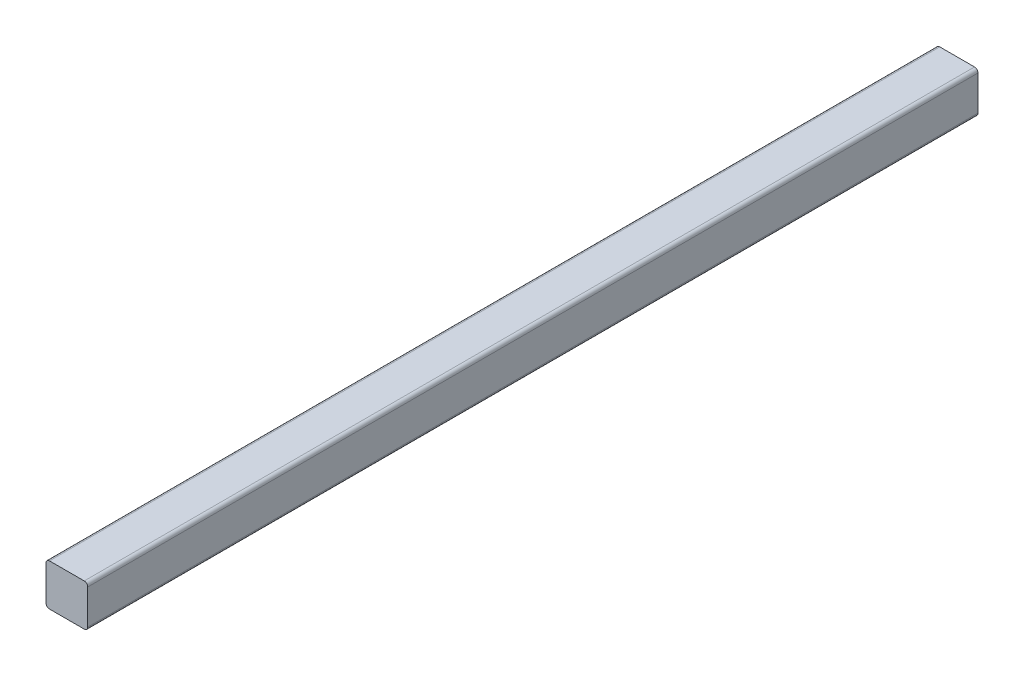
ISO-10303-21;
HEADER;
FILE_DESCRIPTION(('STEP AP214'),'2;1');
FILE_NAME('part.step','',(''),(''),'','','');
FILE_SCHEMA(('AUTOMOTIVE_DESIGN { 1 0 10303 214 1 1 1 1 }'));
ENDSEC;
DATA;
#1=APPLICATION_CONTEXT('core data for automotive mechanical design processes');
#2=APPLICATION_PROTOCOL_DEFINITION('international standard','automotive_design',2000,#1);
#3=PRODUCT_CONTEXT('',#1,'mechanical');
#4=PRODUCT('Part','Part','',(#3));
#5=PRODUCT_RELATED_PRODUCT_CATEGORY('part','',(#4));
#6=PRODUCT_DEFINITION_FORMATION('','',#4);
#7=PRODUCT_DEFINITION_CONTEXT('part definition',#1,'design');
#8=PRODUCT_DEFINITION('design','',#6,#7);
#9=PRODUCT_DEFINITION_SHAPE('','',#8);
#10=(LENGTH_UNIT() NAMED_UNIT(*) SI_UNIT(.MILLI.,.METRE.));
#11=(NAMED_UNIT(*) PLANE_ANGLE_UNIT() SI_UNIT($,.RADIAN.));
#12=(NAMED_UNIT(*) SI_UNIT($,.STERADIAN.) SOLID_ANGLE_UNIT());
#13=UNCERTAINTY_MEASURE_WITH_UNIT(LENGTH_MEASURE(1.E-05),#10,'distance_accuracy_value','');
#14=(GEOMETRIC_REPRESENTATION_CONTEXT(3) GLOBAL_UNCERTAINTY_ASSIGNED_CONTEXT((#13)) GLOBAL_UNIT_ASSIGNED_CONTEXT((#10,
#11,#12)) REPRESENTATION_CONTEXT('',''));
#15=CARTESIAN_POINT('',(0.,0.,0.));
#16=DIRECTION('',(0.,0.,1.));
#17=DIRECTION('',(1.,0.,0.));
#18=AXIS2_PLACEMENT_3D('',#15,#16,#17);
#19=CARTESIAN_POINT('',(19.05,-19.05,812.8));
#20=DIRECTION('',(-1.,0.,0.));
#21=DIRECTION('',(0.,0.,1.));
#22=AXIS2_PLACEMENT_3D('',#19,#20,#21);
#23=PLANE('',#22);
#24=DIRECTION('',(0.,1.,0.));
#25=VECTOR('',#24,1.);
#26=CARTESIAN_POINT('',(19.05,-19.05,812.8));
#27=LINE('',#26,#25);
#28=CARTESIAN_POINT('',(19.05,-15.875,812.8));
#29=VERTEX_POINT('',#28);
#30=CARTESIAN_POINT('',(19.05,15.875,812.8));
#31=VERTEX_POINT('',#30);
#32=EDGE_CURVE('E134',#29,#31,#27,.T.);
#33=ORIENTED_EDGE('',*,*,#32,.F.);
#34=DIRECTION('',(0.,0.,-1.));
#35=VECTOR('',#34,1.);
#36=CARTESIAN_POINT('',(19.05,-15.875,812.8));
#37=LINE('',#36,#35);
#38=CARTESIAN_POINT('',(19.05,-15.875,0.));
#39=VERTEX_POINT('',#38);
#40=EDGE_CURVE('E11',#29,#39,#37,.T.);
#41=ORIENTED_EDGE('',*,*,#40,.T.);
#42=DIRECTION('',(0.,1.,0.));
#43=VECTOR('',#42,1.);
#44=CARTESIAN_POINT('',(19.05,-19.05,0.));
#45=LINE('',#44,#43);
#46=CARTESIAN_POINT('',(19.05,15.875,0.));
#47=VERTEX_POINT('',#46);
#48=EDGE_CURVE('E136',#39,#47,#45,.T.);
#49=ORIENTED_EDGE('',*,*,#48,.T.);
#50=DIRECTION('',(0.,0.,-1.));
#51=VECTOR('',#50,1.);
#52=CARTESIAN_POINT('',(19.05,15.875,812.8));
#53=LINE('',#52,#51);
#54=EDGE_CURVE('E47',#47,#31,#53,.F.);
#55=ORIENTED_EDGE('',*,*,#54,.T.);
#56=EDGE_LOOP('',(#33,#41,#49,#55));
#57=FACE_BOUND('',#56,.T.);
#58=ADVANCED_FACE('F39',(#57),#23,.F.);
#59=CARTESIAN_POINT('',(-19.05,19.05,812.8));
#60=DIRECTION('',(0.,-1.,0.));
#61=DIRECTION('',(0.,0.,-1.));
#62=AXIS2_PLACEMENT_3D('',#59,#60,#61);
#63=PLANE('',#62);
#64=DIRECTION('',(-1.,0.,0.));
#65=VECTOR('',#64,1.);
#66=CARTESIAN_POINT('',(-19.05,19.05,0.));
#67=LINE('',#66,#65);
#68=CARTESIAN_POINT('',(15.875,19.05,0.));
#69=VERTEX_POINT('',#68);
#70=CARTESIAN_POINT('',(-15.875,19.05,0.));
#71=VERTEX_POINT('',#70);
#72=EDGE_CURVE('E132',#69,#71,#67,.T.);
#73=ORIENTED_EDGE('',*,*,#72,.T.);
#74=DIRECTION('',(0.,0.,-1.));
#75=VECTOR('',#74,1.);
#76=CARTESIAN_POINT('',(-15.875,19.05,812.8));
#77=LINE('',#76,#75);
#78=CARTESIAN_POINT('',(-15.875,19.05,812.8));
#79=VERTEX_POINT('',#78);
#80=EDGE_CURVE('E111',#71,#79,#77,.F.);
#81=ORIENTED_EDGE('',*,*,#80,.T.);
#82=DIRECTION('',(-1.,0.,0.));
#83=VECTOR('',#82,1.);
#84=CARTESIAN_POINT('',(-19.05,19.05,812.8));
#85=LINE('',#84,#83);
#86=CARTESIAN_POINT('',(15.875,19.05,812.8));
#87=VERTEX_POINT('',#86);
#88=EDGE_CURVE('E172',#87,#79,#85,.T.);
#89=ORIENTED_EDGE('',*,*,#88,.F.);
#90=DIRECTION('',(0.,0.,-1.));
#91=VECTOR('',#90,1.);
#92=CARTESIAN_POINT('',(15.875,19.05,812.8));
#93=LINE('',#92,#91);
#94=EDGE_CURVE('E116',#87,#69,#93,.T.);
#95=ORIENTED_EDGE('',*,*,#94,.T.);
#96=EDGE_LOOP('',(#73,#81,#89,#95));
#97=FACE_BOUND('',#96,.T.);
#98=ADVANCED_FACE('F176',(#97),#63,.F.);
#99=CARTESIAN_POINT('',(-19.05,-19.05,812.8));
#100=DIRECTION('',(1.,0.,0.));
#101=DIRECTION('',(0.,0.,-1.));
#102=AXIS2_PLACEMENT_3D('',#99,#100,#101);
#103=PLANE('',#102);
#104=DIRECTION('',(0.,-1.,0.));
#105=VECTOR('',#104,1.);
#106=CARTESIAN_POINT('',(-19.05,-19.05,812.8));
#107=LINE('',#106,#105);
#108=CARTESIAN_POINT('',(-19.05,15.875,812.8));
#109=VERTEX_POINT('',#108);
#110=CARTESIAN_POINT('',(-19.05,-15.875,812.8));
#111=VERTEX_POINT('',#110);
#112=EDGE_CURVE('E125',#109,#111,#107,.T.);
#113=ORIENTED_EDGE('',*,*,#112,.F.);
#114=DIRECTION('',(0.,0.,-1.));
#115=VECTOR('',#114,1.);
#116=CARTESIAN_POINT('',(-19.05,15.875,812.8));
#117=LINE('',#116,#115);
#118=CARTESIAN_POINT('',(-19.05,15.875,0.));
#119=VERTEX_POINT('',#118);
#120=EDGE_CURVE('E110',#109,#119,#117,.T.);
#121=ORIENTED_EDGE('',*,*,#120,.T.);
#122=DIRECTION('',(0.,-1.,0.));
#123=VECTOR('',#122,1.);
#124=CARTESIAN_POINT('',(-19.05,-19.05,0.));
#125=LINE('',#124,#123);
#126=CARTESIAN_POINT('',(-19.05,-15.875,0.));
#127=VERTEX_POINT('',#126);
#128=EDGE_CURVE('E123',#119,#127,#125,.T.);
#129=ORIENTED_EDGE('',*,*,#128,.T.);
#130=DIRECTION('',(0.,0.,-1.));
#131=VECTOR('',#130,1.);
#132=CARTESIAN_POINT('',(-19.05,-15.875,812.8));
#133=LINE('',#132,#131);
#134=EDGE_CURVE('E127',#127,#111,#133,.F.);
#135=ORIENTED_EDGE('',*,*,#134,.T.);
#136=EDGE_LOOP('',(#113,#121,#129,#135));
#137=FACE_BOUND('',#136,.T.);
#138=ADVANCED_FACE('F122',(#137),#103,.F.);
#139=CARTESIAN_POINT('',(-19.05,-19.05,812.8));
#140=DIRECTION('',(0.,1.,0.));
#141=DIRECTION('',(0.,0.,1.));
#142=AXIS2_PLACEMENT_3D('',#139,#140,#141);
#143=PLANE('',#142);
#144=DIRECTION('',(1.,0.,0.));
#145=VECTOR('',#144,1.);
#146=CARTESIAN_POINT('',(-19.05,-19.05,812.8));
#147=LINE('',#146,#145);
#148=CARTESIAN_POINT('',(-15.875,-19.05,812.8));
#149=VERTEX_POINT('',#148);
#150=CARTESIAN_POINT('',(15.875,-19.05,812.8));
#151=VERTEX_POINT('',#150);
#152=EDGE_CURVE('E140',#149,#151,#147,.T.);
#153=ORIENTED_EDGE('',*,*,#152,.F.);
#154=DIRECTION('',(0.,0.,-1.));
#155=VECTOR('',#154,1.);
#156=CARTESIAN_POINT('',(-15.875,-19.05,812.8));
#157=LINE('',#156,#155);
#158=CARTESIAN_POINT('',(-15.875,-19.05,0.));
#159=VERTEX_POINT('',#158);
#160=EDGE_CURVE('E157',#149,#159,#157,.T.);
#161=ORIENTED_EDGE('',*,*,#160,.T.);
#162=DIRECTION('',(1.,0.,0.));
#163=VECTOR('',#162,1.);
#164=CARTESIAN_POINT('',(-19.05,-19.05,0.));
#165=LINE('',#164,#163);
#166=CARTESIAN_POINT('',(15.875,-19.05,0.));
#167=VERTEX_POINT('',#166);
#168=EDGE_CURVE('E131',#159,#167,#165,.T.);
#169=ORIENTED_EDGE('',*,*,#168,.T.);
#170=DIRECTION('',(0.,0.,-1.));
#171=VECTOR('',#170,1.);
#172=CARTESIAN_POINT('',(15.875,-19.05,812.8));
#173=LINE('',#172,#171);
#174=EDGE_CURVE('E54',#167,#151,#173,.F.);
#175=ORIENTED_EDGE('',*,*,#174,.T.);
#176=EDGE_LOOP('',(#153,#161,#169,#175));
#177=FACE_BOUND('',#176,.T.);
#178=ADVANCED_FACE('F183',(#177),#143,.F.);
#179=CARTESIAN_POINT('',(0.,0.,812.8));
#180=DIRECTION('',(0.,0.,-1.));
#181=DIRECTION('',(-1.,0.,0.));
#182=AXIS2_PLACEMENT_3D('',#179,#180,#181);
#183=PLANE('',#182);
#184=ORIENTED_EDGE('',*,*,#88,.T.);
#185=CARTESIAN_POINT('',(-15.875,15.875,812.8));
#186=DIRECTION('',(0.,0.,-1.));
#187=DIRECTION('',(-1.,0.,0.));
#188=AXIS2_PLACEMENT_3D('',#185,#186,#187);
#189=CIRCLE('',#188,3.175);
#190=EDGE_CURVE('E154',#79,#109,#189,.F.);
#191=ORIENTED_EDGE('',*,*,#190,.T.);
#192=ORIENTED_EDGE('',*,*,#112,.T.);
#193=CARTESIAN_POINT('',(-15.875,-15.875,812.8));
#194=DIRECTION('',(0.,0.,-1.));
#195=DIRECTION('',(-1.,0.,0.));
#196=AXIS2_PLACEMENT_3D('',#193,#194,#195);
#197=CIRCLE('',#196,3.175);
#198=EDGE_CURVE('E61',#111,#149,#197,.F.);
#199=ORIENTED_EDGE('',*,*,#198,.T.);
#200=ORIENTED_EDGE('',*,*,#152,.T.);
#201=CARTESIAN_POINT('',(15.875,-15.875,812.8));
#202=DIRECTION('',(0.,0.,-1.));
#203=DIRECTION('',(-1.,0.,0.));
#204=AXIS2_PLACEMENT_3D('',#201,#202,#203);
#205=CIRCLE('',#204,3.175);
#206=EDGE_CURVE('E151',#151,#29,#205,.F.);
#207=ORIENTED_EDGE('',*,*,#206,.T.);
#208=ORIENTED_EDGE('',*,*,#32,.T.);
#209=CARTESIAN_POINT('',(15.875,15.875,812.8));
#210=DIRECTION('',(0.,0.,-1.));
#211=DIRECTION('',(-1.,0.,0.));
#212=AXIS2_PLACEMENT_3D('',#209,#210,#211);
#213=CIRCLE('',#212,3.175);
#214=EDGE_CURVE('E149',#31,#87,#213,.F.);
#215=ORIENTED_EDGE('',*,*,#214,.T.);
#216=EDGE_LOOP('',(#184,#191,#192,#199,#200,#207,#208,#215));
#217=FACE_BOUND('',#216,.T.);
#218=ADVANCED_FACE('F169',(#217),#183,.F.);
#219=CARTESIAN_POINT('',(0.,0.,0.));
#220=DIRECTION('',(0.,0.,-1.));
#221=DIRECTION('',(-1.,0.,0.));
#222=AXIS2_PLACEMENT_3D('',#219,#220,#221);
#223=PLANE('',#222);
#224=ORIENTED_EDGE('',*,*,#128,.F.);
#225=CARTESIAN_POINT('',(-15.875,15.875,0.));
#226=DIRECTION('',(0.,0.,-1.));
#227=DIRECTION('',(-1.,0.,0.));
#228=AXIS2_PLACEMENT_3D('',#225,#226,#227);
#229=CIRCLE('',#228,3.175);
#230=EDGE_CURVE('E106',#119,#71,#229,.T.);
#231=ORIENTED_EDGE('',*,*,#230,.T.);
#232=ORIENTED_EDGE('',*,*,#72,.F.);
#233=CARTESIAN_POINT('',(15.875,15.875,0.));
#234=DIRECTION('',(0.,0.,-1.));
#235=DIRECTION('',(-1.,0.,0.));
#236=AXIS2_PLACEMENT_3D('',#233,#234,#235);
#237=CIRCLE('',#236,3.175);
#238=EDGE_CURVE('E126',#69,#47,#237,.T.);
#239=ORIENTED_EDGE('',*,*,#238,.T.);
#240=ORIENTED_EDGE('',*,*,#48,.F.);
#241=CARTESIAN_POINT('',(15.875,-15.875,0.));
#242=DIRECTION('',(0.,0.,-1.));
#243=DIRECTION('',(-1.,0.,0.));
#244=AXIS2_PLACEMENT_3D('',#241,#242,#243);
#245=CIRCLE('',#244,3.175);
#246=EDGE_CURVE('E143',#39,#167,#245,.T.);
#247=ORIENTED_EDGE('',*,*,#246,.T.);
#248=ORIENTED_EDGE('',*,*,#168,.F.);
#249=CARTESIAN_POINT('',(-15.875,-15.875,0.));
#250=DIRECTION('',(0.,0.,-1.));
#251=DIRECTION('',(-1.,0.,0.));
#252=AXIS2_PLACEMENT_3D('',#249,#250,#251);
#253=CIRCLE('',#252,3.175);
#254=EDGE_CURVE('E117',#159,#127,#253,.T.);
#255=ORIENTED_EDGE('',*,*,#254,.T.);
#256=EDGE_LOOP('',(#224,#231,#232,#239,#240,#247,#248,#255));
#257=FACE_BOUND('',#256,.T.);
#258=ADVANCED_FACE('F129',(#257),#223,.T.);
#259=CARTESIAN_POINT('',(-15.875,15.875,812.8));
#260=DIRECTION('',(0.,0.,-1.));
#261=DIRECTION('',(-1.,0.,0.));
#262=AXIS2_PLACEMENT_3D('',#259,#260,#261);
#263=CYLINDRICAL_SURFACE('',#262,3.175);
#264=ORIENTED_EDGE('',*,*,#190,.F.);
#265=ORIENTED_EDGE('',*,*,#80,.F.);
#266=ORIENTED_EDGE('',*,*,#230,.F.);
#267=ORIENTED_EDGE('',*,*,#120,.F.);
#268=EDGE_LOOP('',(#264,#265,#266,#267));
#269=FACE_BOUND('',#268,.T.);
#270=ADVANCED_FACE('F109',(#269),#263,.T.);
#271=CARTESIAN_POINT('',(-15.875,-15.875,812.8));
#272=DIRECTION('',(0.,0.,-1.));
#273=DIRECTION('',(-1.,0.,0.));
#274=AXIS2_PLACEMENT_3D('',#271,#272,#273);
#275=CYLINDRICAL_SURFACE('',#274,3.175);
#276=ORIENTED_EDGE('',*,*,#198,.F.);
#277=ORIENTED_EDGE('',*,*,#134,.F.);
#278=ORIENTED_EDGE('',*,*,#254,.F.);
#279=ORIENTED_EDGE('',*,*,#160,.F.);
#280=EDGE_LOOP('',(#276,#277,#278,#279));
#281=FACE_BOUND('',#280,.T.);
#282=ADVANCED_FACE('F182',(#281),#275,.T.);
#283=CARTESIAN_POINT('',(15.875,-15.875,812.8));
#284=DIRECTION('',(0.,0.,-1.));
#285=DIRECTION('',(-1.,0.,0.));
#286=AXIS2_PLACEMENT_3D('',#283,#284,#285);
#287=CYLINDRICAL_SURFACE('',#286,3.175);
#288=ORIENTED_EDGE('',*,*,#206,.F.);
#289=ORIENTED_EDGE('',*,*,#174,.F.);
#290=ORIENTED_EDGE('',*,*,#246,.F.);
#291=ORIENTED_EDGE('',*,*,#40,.F.);
#292=EDGE_LOOP('',(#288,#289,#290,#291));
#293=FACE_BOUND('',#292,.T.);
#294=ADVANCED_FACE('F185',(#293),#287,.T.);
#295=CARTESIAN_POINT('',(15.875,15.875,812.8));
#296=DIRECTION('',(0.,0.,-1.));
#297=DIRECTION('',(-1.,0.,0.));
#298=AXIS2_PLACEMENT_3D('',#295,#296,#297);
#299=CYLINDRICAL_SURFACE('',#298,3.175);
#300=ORIENTED_EDGE('',*,*,#214,.F.);
#301=ORIENTED_EDGE('',*,*,#54,.F.);
#302=ORIENTED_EDGE('',*,*,#238,.F.);
#303=ORIENTED_EDGE('',*,*,#94,.F.);
#304=EDGE_LOOP('',(#300,#301,#302,#303));
#305=FACE_BOUND('',#304,.T.);
#306=ADVANCED_FACE('F41',(#305),#299,.T.);
#307=CLOSED_SHELL('',(#58,#98,#138,#178,#218,#258,#270,#282,#294,#306));
#308=MANIFOLD_SOLID_BREP('B2',#307);
#309=ADVANCED_BREP_SHAPE_REPRESENTATION('',(#18,#308),#14);
#310=SHAPE_DEFINITION_REPRESENTATION(#9,#309);
ENDSEC;
END-ISO-10303-21;
